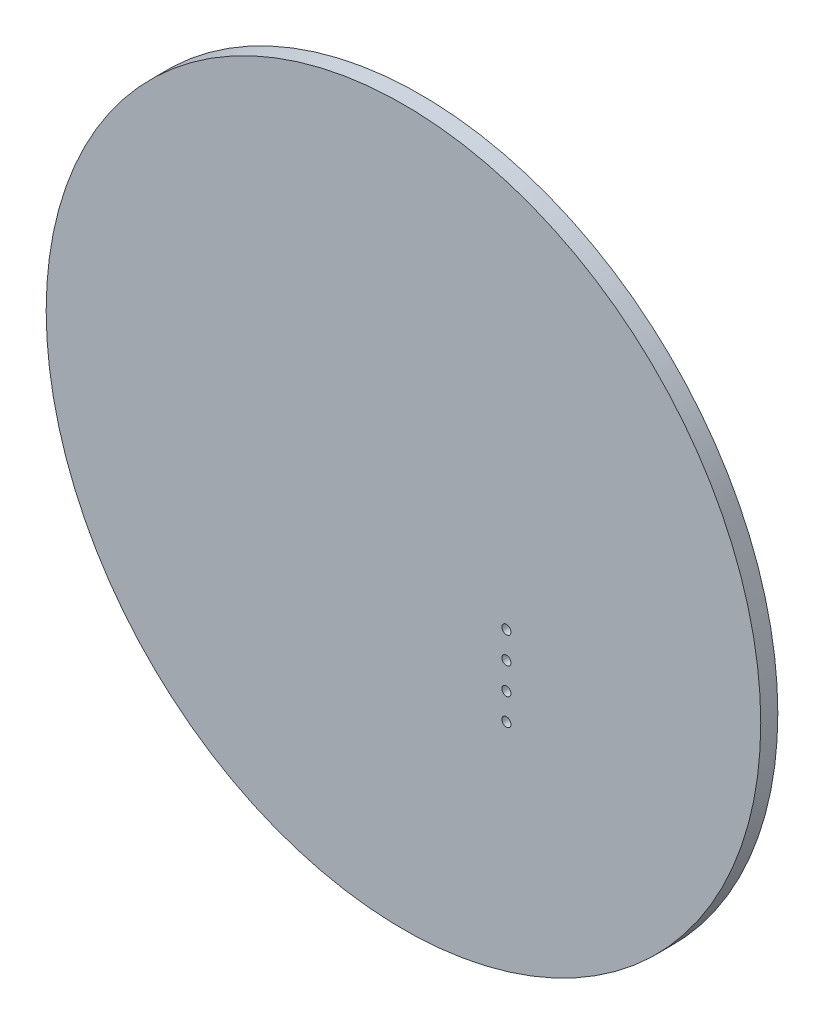
ISO-10303-21;
HEADER;
FILE_DESCRIPTION(('STEP AP214'),'2;1');
FILE_NAME('part.step','',(''),(''),'','','');
FILE_SCHEMA(('AUTOMOTIVE_DESIGN { 1 0 10303 214 1 1 1 1 }'));
ENDSEC;
DATA;
#1=APPLICATION_CONTEXT('core data for automotive mechanical design processes');
#2=APPLICATION_PROTOCOL_DEFINITION('international standard','automotive_design',2000,#1);
#3=PRODUCT_CONTEXT('',#1,'mechanical');
#4=PRODUCT('Part','Part','',(#3));
#5=PRODUCT_RELATED_PRODUCT_CATEGORY('part','',(#4));
#6=PRODUCT_DEFINITION_FORMATION('','',#4);
#7=PRODUCT_DEFINITION_CONTEXT('part definition',#1,'design');
#8=PRODUCT_DEFINITION('design','',#6,#7);
#9=PRODUCT_DEFINITION_SHAPE('','',#8);
#10=(LENGTH_UNIT() NAMED_UNIT(*) SI_UNIT(.MILLI.,.METRE.));
#11=(NAMED_UNIT(*) PLANE_ANGLE_UNIT() SI_UNIT($,.RADIAN.));
#12=(NAMED_UNIT(*) SI_UNIT($,.STERADIAN.) SOLID_ANGLE_UNIT());
#13=UNCERTAINTY_MEASURE_WITH_UNIT(LENGTH_MEASURE(1.E-05),#10,'distance_accuracy_value','');
#14=(GEOMETRIC_REPRESENTATION_CONTEXT(3) GLOBAL_UNCERTAINTY_ASSIGNED_CONTEXT((#13)) GLOBAL_UNIT_ASSIGNED_CONTEXT((#10,
#11,#12)) REPRESENTATION_CONTEXT('',''));
#15=CARTESIAN_POINT('',(0.,0.,0.));
#16=DIRECTION('',(0.,0.,1.));
#17=DIRECTION('',(1.,0.,0.));
#18=AXIS2_PLACEMENT_3D('',#15,#16,#17);
#19=CARTESIAN_POINT('',(0.,0.,1.6));
#20=DIRECTION('',(0.,0.,1.));
#21=DIRECTION('',(1.,0.,0.));
#22=AXIS2_PLACEMENT_3D('',#19,#20,#21);
#23=PLANE('',#22);
#24=CARTESIAN_POINT('',(9.652,-9.318,1.6));
#25=DIRECTION('',(0.,0.,1.));
#26=DIRECTION('',(1.,0.,0.));
#27=AXIS2_PLACEMENT_3D('',#24,#25,#26);
#28=CIRCLE('',#27,0.425);
#29=CARTESIAN_POINT('',(10.077,-9.318,1.6));
#30=VERTEX_POINT('',#29);
#31=EDGE_CURVE('E37',#30,#30,#28,.F.);
#32=ORIENTED_EDGE('',*,*,#31,.T.);
#33=EDGE_LOOP('',(#32));
#34=FACE_BOUND('',#33,.T.);
#35=CARTESIAN_POINT('',(9.652,-11.818,1.6));
#36=DIRECTION('',(0.,0.,1.));
#37=DIRECTION('',(1.,0.,0.));
#38=AXIS2_PLACEMENT_3D('',#35,#36,#37);
#39=CIRCLE('',#38,0.425);
#40=CARTESIAN_POINT('',(10.077,-11.818,1.6));
#41=VERTEX_POINT('',#40);
#42=EDGE_CURVE('E40',#41,#41,#39,.F.);
#43=ORIENTED_EDGE('',*,*,#42,.T.);
#44=EDGE_LOOP('',(#43));
#45=FACE_BOUND('',#44,.T.);
#46=CARTESIAN_POINT('',(9.652,-4.318,1.6));
#47=DIRECTION('',(0.,0.,1.));
#48=DIRECTION('',(1.,0.,0.));
#49=AXIS2_PLACEMENT_3D('',#46,#47,#48);
#50=CIRCLE('',#49,0.425);
#51=CARTESIAN_POINT('',(10.077,-4.318,1.6));
#52=VERTEX_POINT('',#51);
#53=EDGE_CURVE('E45',#52,#52,#50,.F.);
#54=ORIENTED_EDGE('',*,*,#53,.T.);
#55=EDGE_LOOP('',(#54));
#56=FACE_BOUND('',#55,.T.);
#57=CARTESIAN_POINT('',(9.652,-6.818,1.6));
#58=DIRECTION('',(0.,0.,1.));
#59=DIRECTION('',(1.,0.,0.));
#60=AXIS2_PLACEMENT_3D('',#57,#58,#59);
#61=CIRCLE('',#60,0.425);
#62=CARTESIAN_POINT('',(10.077,-6.818,1.6));
#63=VERTEX_POINT('',#62);
#64=EDGE_CURVE('E43',#63,#63,#61,.F.);
#65=ORIENTED_EDGE('',*,*,#64,.T.);
#66=EDGE_LOOP('',(#65));
#67=FACE_BOUND('',#66,.T.);
#68=CARTESIAN_POINT('',(0.,0.,1.6));
#69=DIRECTION('',(0.,0.,-1.));
#70=DIRECTION('',(-1.,0.,0.));
#71=AXIS2_PLACEMENT_3D('',#68,#69,#70);
#72=CIRCLE('',#71,33.5);
#73=CARTESIAN_POINT('',(-33.5,0.,1.6));
#74=VERTEX_POINT('',#73);
#75=EDGE_CURVE('E17',#74,#74,#72,.T.);
#76=ORIENTED_EDGE('',*,*,#75,.F.);
#77=EDGE_LOOP('',(#76));
#78=FACE_BOUND('',#77,.T.);
#79=ADVANCED_FACE('F14',(#34,#45,#56,#67,#78),#23,.T.);
#80=CARTESIAN_POINT('',(0.,0.,0.));
#81=DIRECTION('',(0.,0.,-1.));
#82=DIRECTION('',(-1.,0.,0.));
#83=AXIS2_PLACEMENT_3D('',#80,#81,#82);
#84=CYLINDRICAL_SURFACE('',#83,33.5);
#85=ORIENTED_EDGE('',*,*,#75,.T.);
#86=EDGE_LOOP('',(#85));
#87=FACE_BOUND('',#86,.T.);
#88=CARTESIAN_POINT('',(0.,0.,0.));
#89=DIRECTION('',(0.,0.,-1.));
#90=DIRECTION('',(-1.,0.,0.));
#91=AXIS2_PLACEMENT_3D('',#88,#89,#90);
#92=CIRCLE('',#91,33.5);
#93=CARTESIAN_POINT('',(-33.5,0.,0.));
#94=VERTEX_POINT('',#93);
#95=EDGE_CURVE('E34',#94,#94,#92,.F.);
#96=ORIENTED_EDGE('',*,*,#95,.T.);
#97=EDGE_LOOP('',(#96));
#98=FACE_BOUND('',#97,.T.);
#99=ADVANCED_FACE('F52',(#87,#98),#84,.T.);
#100=CARTESIAN_POINT('',(9.652,-4.318,-0.8));
#101=DIRECTION('',(0.,0.,1.));
#102=DIRECTION('',(1.,0.,0.));
#103=AXIS2_PLACEMENT_3D('',#100,#101,#102);
#104=CYLINDRICAL_SURFACE('',#103,0.425);
#105=CARTESIAN_POINT('',(9.652,-4.318,0.));
#106=DIRECTION('',(0.,0.,1.));
#107=DIRECTION('',(1.,0.,0.));
#108=AXIS2_PLACEMENT_3D('',#105,#106,#107);
#109=CIRCLE('',#108,0.425);
#110=CARTESIAN_POINT('',(10.077,-4.318,0.));
#111=VERTEX_POINT('',#110);
#112=EDGE_CURVE('E31',#111,#111,#109,.F.);
#113=ORIENTED_EDGE('',*,*,#112,.T.);
#114=EDGE_LOOP('',(#113));
#115=FACE_BOUND('',#114,.T.);
#116=ORIENTED_EDGE('',*,*,#53,.F.);
#117=EDGE_LOOP('',(#116));
#118=FACE_BOUND('',#117,.T.);
#119=ADVANCED_FACE('F61',(#115,#118),#104,.F.);
#120=CARTESIAN_POINT('',(9.652,-6.818,-0.8));
#121=DIRECTION('',(0.,0.,1.));
#122=DIRECTION('',(1.,0.,0.));
#123=AXIS2_PLACEMENT_3D('',#120,#121,#122);
#124=CYLINDRICAL_SURFACE('',#123,0.425);
#125=CARTESIAN_POINT('',(9.652,-6.818,0.));
#126=DIRECTION('',(0.,0.,1.));
#127=DIRECTION('',(1.,0.,0.));
#128=AXIS2_PLACEMENT_3D('',#125,#126,#127);
#129=CIRCLE('',#128,0.425);
#130=CARTESIAN_POINT('',(10.077,-6.818,0.));
#131=VERTEX_POINT('',#130);
#132=EDGE_CURVE('E26',#131,#131,#129,.F.);
#133=ORIENTED_EDGE('',*,*,#132,.T.);
#134=EDGE_LOOP('',(#133));
#135=FACE_BOUND('',#134,.T.);
#136=ORIENTED_EDGE('',*,*,#64,.F.);
#137=EDGE_LOOP('',(#136));
#138=FACE_BOUND('',#137,.T.);
#139=ADVANCED_FACE('F77',(#135,#138),#124,.F.);
#140=CARTESIAN_POINT('',(9.652,-11.818,-0.8));
#141=DIRECTION('',(0.,0.,1.));
#142=DIRECTION('',(1.,0.,0.));
#143=AXIS2_PLACEMENT_3D('',#140,#141,#142);
#144=CYLINDRICAL_SURFACE('',#143,0.425);
#145=CARTESIAN_POINT('',(9.652,-11.818,0.));
#146=DIRECTION('',(0.,0.,1.));
#147=DIRECTION('',(1.,0.,0.));
#148=AXIS2_PLACEMENT_3D('',#145,#146,#147);
#149=CIRCLE('',#148,0.425);
#150=CARTESIAN_POINT('',(10.077,-11.818,0.));
#151=VERTEX_POINT('',#150);
#152=EDGE_CURVE('E21',#151,#151,#149,.F.);
#153=ORIENTED_EDGE('',*,*,#152,.T.);
#154=EDGE_LOOP('',(#153));
#155=FACE_BOUND('',#154,.T.);
#156=ORIENTED_EDGE('',*,*,#42,.F.);
#157=EDGE_LOOP('',(#156));
#158=FACE_BOUND('',#157,.T.);
#159=ADVANCED_FACE('F71',(#155,#158),#144,.F.);
#160=CARTESIAN_POINT('',(9.652,-9.318,-0.8));
#161=DIRECTION('',(0.,0.,1.));
#162=DIRECTION('',(1.,0.,0.));
#163=AXIS2_PLACEMENT_3D('',#160,#161,#162);
#164=CYLINDRICAL_SURFACE('',#163,0.425);
#165=CARTESIAN_POINT('',(9.652,-9.318,0.));
#166=DIRECTION('',(0.,0.,1.));
#167=DIRECTION('',(1.,0.,0.));
#168=AXIS2_PLACEMENT_3D('',#165,#166,#167);
#169=CIRCLE('',#168,0.425);
#170=CARTESIAN_POINT('',(10.077,-9.318,0.));
#171=VERTEX_POINT('',#170);
#172=EDGE_CURVE('E10',#171,#171,#169,.F.);
#173=ORIENTED_EDGE('',*,*,#172,.T.);
#174=EDGE_LOOP('',(#173));
#175=FACE_BOUND('',#174,.T.);
#176=ORIENTED_EDGE('',*,*,#31,.F.);
#177=EDGE_LOOP('',(#176));
#178=FACE_BOUND('',#177,.T.);
#179=ADVANCED_FACE('F65',(#175,#178),#164,.F.);
#180=CARTESIAN_POINT('',(0.,0.,0.));
#181=DIRECTION('',(0.,0.,1.));
#182=DIRECTION('',(1.,0.,0.));
#183=AXIS2_PLACEMENT_3D('',#180,#181,#182);
#184=PLANE('',#183);
#185=ORIENTED_EDGE('',*,*,#172,.F.);
#186=EDGE_LOOP('',(#185));
#187=FACE_BOUND('',#186,.T.);
#188=ORIENTED_EDGE('',*,*,#152,.F.);
#189=EDGE_LOOP('',(#188));
#190=FACE_BOUND('',#189,.T.);
#191=ORIENTED_EDGE('',*,*,#132,.F.);
#192=EDGE_LOOP('',(#191));
#193=FACE_BOUND('',#192,.T.);
#194=ORIENTED_EDGE('',*,*,#112,.F.);
#195=EDGE_LOOP('',(#194));
#196=FACE_BOUND('',#195,.T.);
#197=ORIENTED_EDGE('',*,*,#95,.F.);
#198=EDGE_LOOP('',(#197));
#199=FACE_BOUND('',#198,.T.);
#200=ADVANCED_FACE('F63',(#187,#190,#193,#196,#199),#184,.F.);
#201=CLOSED_SHELL('',(#79,#99,#119,#139,#159,#179,#200));
#202=MANIFOLD_SOLID_BREP('B1',#201);
#203=ADVANCED_BREP_SHAPE_REPRESENTATION('',(#18,#202),#14);
#204=SHAPE_DEFINITION_REPRESENTATION(#9,#203);
ENDSEC;
END-ISO-10303-21;
